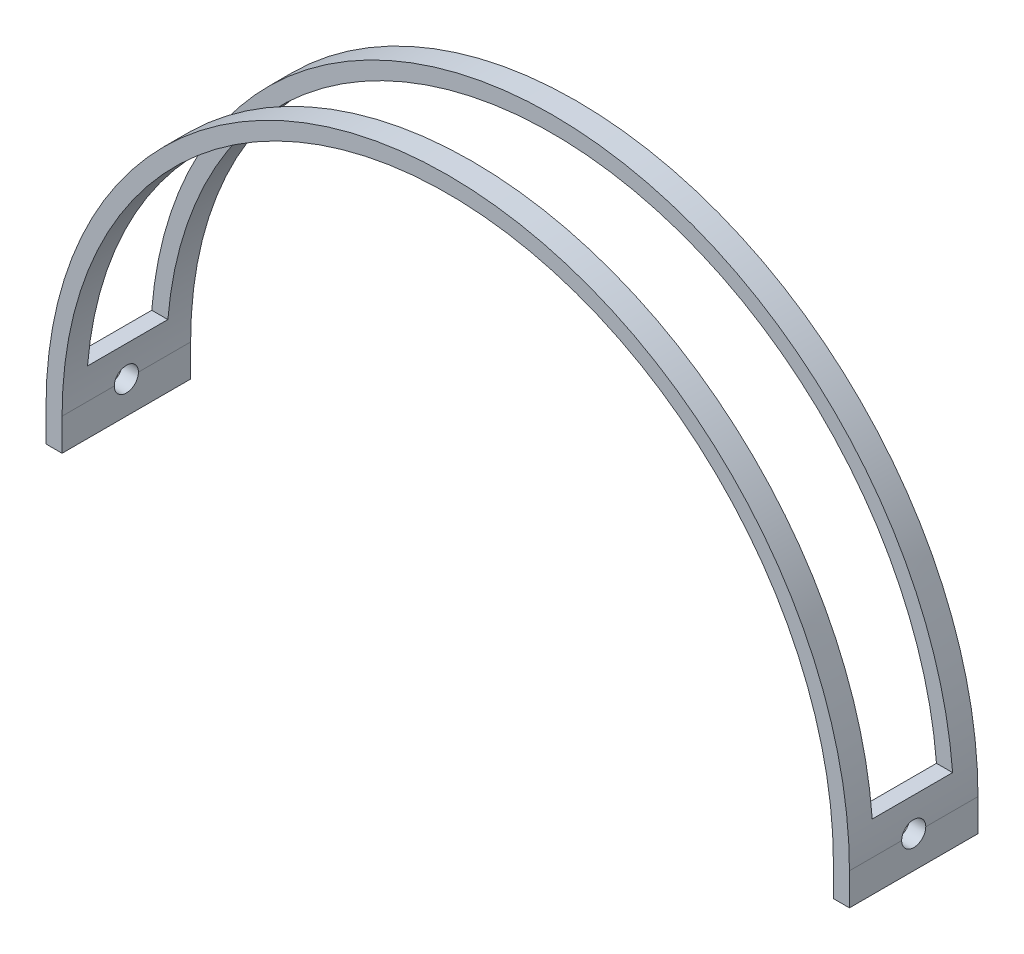
ISO-10303-21;
HEADER;
FILE_DESCRIPTION(('STEP AP214'),'2;1');
FILE_NAME('part.step','',(''),(''),'','','');
FILE_SCHEMA(('AUTOMOTIVE_DESIGN { 1 0 10303 214 1 1 1 1 }'));
ENDSEC;
DATA;
#1=APPLICATION_CONTEXT('core data for automotive mechanical design processes');
#2=APPLICATION_PROTOCOL_DEFINITION('international standard','automotive_design',2000,#1);
#3=PRODUCT_CONTEXT('',#1,'mechanical');
#4=PRODUCT('Part','Part','',(#3));
#5=PRODUCT_RELATED_PRODUCT_CATEGORY('part','',(#4));
#6=PRODUCT_DEFINITION_FORMATION('','',#4);
#7=PRODUCT_DEFINITION_CONTEXT('part definition',#1,'design');
#8=PRODUCT_DEFINITION('design','',#6,#7);
#9=PRODUCT_DEFINITION_SHAPE('','',#8);
#10=(LENGTH_UNIT() NAMED_UNIT(*) SI_UNIT(.MILLI.,.METRE.));
#11=(NAMED_UNIT(*) PLANE_ANGLE_UNIT() SI_UNIT($,.RADIAN.));
#12=(NAMED_UNIT(*) SI_UNIT($,.STERADIAN.) SOLID_ANGLE_UNIT());
#13=UNCERTAINTY_MEASURE_WITH_UNIT(LENGTH_MEASURE(1.E-05),#10,'distance_accuracy_value','');
#14=(GEOMETRIC_REPRESENTATION_CONTEXT(3) GLOBAL_UNCERTAINTY_ASSIGNED_CONTEXT((#13)) GLOBAL_UNIT_ASSIGNED_CONTEXT((#10,
#11,#12)) REPRESENTATION_CONTEXT('',''));
#15=CARTESIAN_POINT('',(0.,0.,0.));
#16=DIRECTION('',(0.,0.,1.));
#17=DIRECTION('',(1.,0.,0.));
#18=AXIS2_PLACEMENT_3D('',#15,#16,#17);
#19=CARTESIAN_POINT('',(0.,0.,80.));
#20=DIRECTION('',(0.,0.,-1.));
#21=DIRECTION('',(-1.,0.,0.));
#22=AXIS2_PLACEMENT_3D('',#19,#20,#21);
#23=CYLINDRICAL_SURFACE('',#22,240.);
#24=DIRECTION('',(0.,0.,-1.));
#25=VECTOR('',#24,1.);
#26=CARTESIAN_POINT('',(239.165214862028,20.,80.));
#27=LINE('',#26,#25);
#28=CARTESIAN_POINT('',(239.165214862028,20.,65.));
#29=VERTEX_POINT('',#28);
#30=CARTESIAN_POINT('',(239.165214862028,20.,15.));
#31=VERTEX_POINT('',#30);
#32=EDGE_CURVE('E147',#29,#31,#27,.T.);
#33=ORIENTED_EDGE('',*,*,#32,.T.);
#34=CARTESIAN_POINT('',(0.,0.,15.));
#35=DIRECTION('',(0.,0.,-1.));
#36=DIRECTION('',(0.,1.,0.));
#37=AXIS2_PLACEMENT_3D('',#34,#35,#36);
#38=CIRCLE('',#37,240.);
#39=CARTESIAN_POINT('',(-239.165214862028,20.,15.));
#40=VERTEX_POINT('',#39);
#41=EDGE_CURVE('E161',#31,#40,#38,.F.);
#42=ORIENTED_EDGE('',*,*,#41,.T.);
#43=DIRECTION('',(0.,0.,-1.));
#44=VECTOR('',#43,1.);
#45=CARTESIAN_POINT('',(-239.165214862028,20.,80.));
#46=LINE('',#45,#44);
#47=CARTESIAN_POINT('',(-239.165214862028,20.,65.));
#48=VERTEX_POINT('',#47);
#49=EDGE_CURVE('E153',#40,#48,#46,.F.);
#50=ORIENTED_EDGE('',*,*,#49,.T.);
#51=CARTESIAN_POINT('',(0.,0.,65.));
#52=DIRECTION('',(0.,0.,1.));
#53=DIRECTION('',(0.,-1.,0.));
#54=AXIS2_PLACEMENT_3D('',#51,#52,#53);
#55=CIRCLE('',#54,240.);
#56=EDGE_CURVE('E142',#48,#29,#55,.F.);
#57=ORIENTED_EDGE('',*,*,#56,.T.);
#58=EDGE_LOOP('',(#33,#42,#50,#57));
#59=FACE_BOUND('',#58,.T.);
#60=DIRECTION('',(0.,0.,-1.));
#61=VECTOR('',#60,1.);
#62=CARTESIAN_POINT('',(240.,0.,80.));
#63=LINE('',#62,#61);
#64=CARTESIAN_POINT('',(240.,0.,32.5));
#65=VERTEX_POINT('',#64);
#66=CARTESIAN_POINT('',(240.,0.,0.));
#67=VERTEX_POINT('',#66);
#68=EDGE_CURVE('E239',#65,#67,#63,.T.);
#69=ORIENTED_EDGE('',*,*,#68,.F.);
#70=CARTESIAN_POINT('',(240.,0.,32.5));
#71=CARTESIAN_POINT('',(240.000002801135,0.210885208766696,32.4999772629314));
#72=CARTESIAN_POINT('',(239.99972214184,0.421767080877066,32.5088935588531));
#73=CARTESIAN_POINT('',(239.998614146376,0.842021105951972,32.5444399422899));
#74=CARTESIAN_POINT('',(239.997786837365,1.05139333339748,32.5710691497785));
#75=CARTESIAN_POINT('',(239.995606570875,1.46699603359064,32.6418515245403));
#76=CARTESIAN_POINT('',(239.994253993733,1.67322866762785,32.6859920127359));
#77=CARTESIAN_POINT('',(239.991062411202,2.08124009056733,32.7914750007671));
#78=CARTESIAN_POINT('',(239.98922341154,2.2830189318603,32.8528172981386));
#79=CARTESIAN_POINT('',(239.985110301719,2.68074743274702,32.9922887255023));
#80=CARTESIAN_POINT('',(239.982836071098,2.87669546109411,33.0704225037889));
#81=CARTESIAN_POINT('',(239.977916476103,3.26138358145405,33.2429422021313));
#82=CARTESIAN_POINT('',(239.975270974911,3.45012098347058,33.3373341164899));
#83=CARTESIAN_POINT('',(239.969685592726,3.81890001023004,33.5416394831287));
#84=CARTESIAN_POINT('',(239.966745824646,3.99894493135549,33.6515469885108));
#85=CARTESIAN_POINT('',(239.960654366662,4.34914141315914,33.886131623219));
#86=CARTESIAN_POINT('',(239.957502673391,4.519292816558,34.0108089872491));
#87=CARTESIAN_POINT('',(239.951075768427,4.84854247021864,34.2740869993846));
#88=CARTESIAN_POINT('',(239.947800519183,5.00763731778458,34.4126919019237));
#89=CARTESIAN_POINT('',(239.941220244381,5.31359083532973,34.7028122709199));
#90=CARTESIAN_POINT('',(239.937915218115,5.46044921403927,34.854328044526));
#91=CARTESIAN_POINT('',(239.931369340442,5.74087826415524,35.1691864657692));
#92=CARTESIAN_POINT('',(239.928128486958,5.87444936615028,35.3325287298593));
#93=CARTESIAN_POINT('',(239.921801705776,6.12740440892163,35.6699435004097));
#94=CARTESIAN_POINT('',(239.918715832118,6.2467834205807,35.8440197032276));
#95=CARTESIAN_POINT('',(239.91278843918,6.4704296680287,36.2015795487218));
#96=CARTESIAN_POINT('',(239.90994687222,6.57469985522407,36.3850613445734));
#97=CARTESIAN_POINT('',(239.904587126646,6.76745002628413,36.7602295773302));
#98=CARTESIAN_POINT('',(239.902069067485,6.85592418223073,36.9519190102224));
#99=CARTESIAN_POINT('',(239.897429755301,7.01638383409342,37.3420254079224));
#100=CARTESIAN_POINT('',(239.895308399258,7.08837361197202,37.5404406102433));
#101=CARTESIAN_POINT('',(239.891521941241,7.21538225238837,37.9426391809427));
#102=CARTESIAN_POINT('',(239.889856848729,7.2704007629731,38.1464226605544));
#103=CARTESIAN_POINT('',(239.8870307762,7.36305750684572,38.5578378063425));
#104=CARTESIAN_POINT('',(239.885869634194,7.40070132526553,38.7654682135615));
#105=CARTESIAN_POINT('',(239.884083684815,7.45836635336048,39.1831645053278));
#106=CARTESIAN_POINT('',(239.883458878057,7.4783875427979,39.3932303926717));
#107=CARTESIAN_POINT('',(239.882763352469,7.50066472781876,39.8143094668946));
#108=CARTESIAN_POINT('',(239.882692650704,7.50292017624403,40.0253226827497));
#109=CARTESIAN_POINT('',(239.88310738596,7.48964848928435,40.4467840948299));
#110=CARTESIAN_POINT('',(239.883592811128,7.47412173289343,40.6572323030013));
#111=CARTESIAN_POINT('',(239.885105846259,7.42540136680253,41.0760338055421));
#112=CARTESIAN_POINT('',(239.886133359964,7.39221089361965,41.2843874651467));
#113=CARTESIAN_POINT('',(239.888700873051,7.30841619128841,41.6974849861364));
#114=CARTESIAN_POINT('',(239.890240695522,7.25781797314661,41.9022300679655));
#115=CARTESIAN_POINT('',(239.893789524458,7.13955491515325,42.306766714726));
#116=CARTESIAN_POINT('',(239.895798616106,7.07188697658105,42.5065573730247));
#117=CARTESIAN_POINT('',(239.900228740613,6.91997253929826,42.8997229829981));
#118=CARTESIAN_POINT('',(239.902649763981,6.83572642262954,43.0930980823985));
#119=CARTESIAN_POINT('',(239.907835653109,6.65123334653746,43.4721068791441));
#120=CARTESIAN_POINT('',(239.910600595258,6.55098283094891,43.6577388443814));
#121=CARTESIAN_POINT('',(239.916395375651,6.33520890831295,44.0198950658144));
#122=CARTESIAN_POINT('',(239.91942520987,6.21968573332029,44.196419460335));
#123=CARTESIAN_POINT('',(239.925664299888,5.97416819637151,44.5391358363975));
#124=CARTESIAN_POINT('',(239.928873581763,5.84417172847789,44.7053263088041));
#125=CARTESIAN_POINT('',(239.935378903141,5.57069520526451,45.0261079580925));
#126=CARTESIAN_POINT('',(239.938674910223,5.42722013847309,45.1807033885846));
#127=CARTESIAN_POINT('',(239.945263534922,5.12766604646233,45.4773629295521));
#128=CARTESIAN_POINT('',(239.948556148928,4.97157886588342,45.6194188053537));
#129=CARTESIAN_POINT('',(239.955041260607,4.64804656324646,45.8898299367885));
#130=CARTESIAN_POINT('',(239.958233792488,4.48060538529852,46.018189910582));
#131=CARTESIAN_POINT('',(239.964430957927,4.13541799353774,46.2604151057325));
#132=CARTESIAN_POINT('',(239.967435495697,3.9576666138665,46.3742729679874));
#133=CARTESIAN_POINT('',(239.973169525517,3.59320432076461,46.5866046307169));
#134=CARTESIAN_POINT('',(239.975899025968,3.40649368124544,46.685078901123));
#135=CARTESIAN_POINT('',(239.981007239503,3.02531229273361,46.8660048906742));
#136=CARTESIAN_POINT('',(239.983385725243,2.83083661718769,46.948446236542));
#137=CARTESIAN_POINT('',(239.987722133137,2.43562530726583,47.0966375580955));
#138=CARTESIAN_POINT('',(239.98968006456,2.23488981096718,47.1623879016545));
#139=CARTESIAN_POINT('',(239.993117554505,1.82885107724443,47.2766567361662));
#140=CARTESIAN_POINT('',(239.994597720728,1.62355400028839,47.3251971253681));
#141=CARTESIAN_POINT('',(239.997040525409,1.20967980881004,47.4047990119401));
#142=CARTESIAN_POINT('',(239.998003417688,1.00110435475552,47.4358690821276));
#143=CARTESIAN_POINT('',(239.999128417167,0.660064240454553,47.4720699402263));
#144=CARTESIAN_POINT('',(239.999455162185,0.528144866722649,47.482550361737));
#145=CARTESIAN_POINT('',(239.999890942592,0.26415489604813,47.4965103939474));
#146=CARTESIAN_POINT('',(240.00000033748,0.132084910944602,47.500001565058));
#147=CARTESIAN_POINT('',(240.,0.,47.5));
#148=B_SPLINE_CURVE_WITH_KNOTS('',3,(#70,#71,#72,#73,#74,#75,#76,#77,#78,#79,#80,#81,#82,#83,
#84,#85,#86,#87,#88,#89,#90,#91,#92,#93,#94,#95,#96,#97,#98,#99,#100,#101,#102,#103,#104,#105,
#106,#107,#108,#109,#110,#111,#112,#113,#114,#115,#116,#117,#118,#119,#120,#121,#122,#123,#124,
#125,#126,#127,#128,#129,#130,#131,#132,#133,#134,#135,#136,#137,#138,#139,#140,#141,#142,#143,
#144,#145,#146,#147),.UNSPECIFIED.,.F.,.F.,(4,2,2,2,2,2,2,2,2,2,2,2,2,2,2,2,2,2,2,2,2,2,2,2,2,2,
2,2,2,2,2,2,2,2,2,2,2,2,4),(0.,0.632462309478233,1.26489319882012,1.89686700862195,
2.52883338044546,3.16097492194917,3.7933500321035,4.42548341694371,5.05762684819511,
5.68996397021892,6.32231613972412,6.95464781049126,7.58719846147912,8.21962538092255,
8.85228515314943,9.48478039952413,10.1172887618108,10.7495936610855,11.3818992864943,
12.014224385892,12.6465360087288,13.2787353904766,13.9107166884462,14.5428127946555,
15.1748943360009,15.8071165213642,16.4393291017657,17.071633792822,17.7037053783765,
18.336189001837,18.9684540299892,19.6010386337462,20.233603909799,20.8665771028749,
21.499536343875,22.1316872812892,22.7635277461418,23.1603635501253,23.5565424327665),.UNSPECIFIED.);
#149=CARTESIAN_POINT('',(240.,0.,47.5));
#150=VERTEX_POINT('',#149);
#151=EDGE_CURVE('E454',#65,#150,#148,.T.);
#152=ORIENTED_EDGE('',*,*,#151,.T.);
#153=CARTESIAN_POINT('',(240.,0.,80.));
#154=VERTEX_POINT('',#153);
#155=EDGE_CURVE('E231',#154,#150,#63,.T.);
#156=ORIENTED_EDGE('',*,*,#155,.F.);
#157=CARTESIAN_POINT('',(0.,0.,80.));
#158=DIRECTION('',(0.,0.,-1.));
#159=DIRECTION('',(1.,0.,0.));
#160=AXIS2_PLACEMENT_3D('',#157,#158,#159);
#161=CIRCLE('',#160,240.);
#162=CARTESIAN_POINT('',(-240.,0.,80.));
#163=VERTEX_POINT('',#162);
#164=EDGE_CURVE('E399',#163,#154,#161,.T.);
#165=ORIENTED_EDGE('',*,*,#164,.F.);
#166=DIRECTION('',(0.,0.,-1.));
#167=VECTOR('',#166,1.);
#168=CARTESIAN_POINT('',(-240.,0.,80.));
#169=LINE('',#168,#167);
#170=CARTESIAN_POINT('',(-240.,0.,47.5));
#171=VERTEX_POINT('',#170);
#172=EDGE_CURVE('E394',#163,#171,#169,.T.);
#173=ORIENTED_EDGE('',*,*,#172,.T.);
#174=CARTESIAN_POINT('',(-240.,0.,47.5));
#175=CARTESIAN_POINT('',(-240.000002801135,0.210885208766666,47.5000227370686));
#176=CARTESIAN_POINT('',(-239.99972214184,0.421767080877036,47.4911064411469));
#177=CARTESIAN_POINT('',(-239.998614146376,0.842021105951942,47.4555600577101));
#178=CARTESIAN_POINT('',(-239.997786837365,1.05139333339745,47.4289308502215));
#179=CARTESIAN_POINT('',(-239.995606570875,1.46699603359061,47.3581484754597));
#180=CARTESIAN_POINT('',(-239.994253993733,1.67322866762782,47.3140079872641));
#181=CARTESIAN_POINT('',(-239.991062411202,2.0812400905673,47.2085249992329));
#182=CARTESIAN_POINT('',(-239.98922341154,2.28301893186027,47.1471827018614));
#183=CARTESIAN_POINT('',(-239.985110301719,2.68074743274699,47.0077112744977));
#184=CARTESIAN_POINT('',(-239.982836071098,2.87669546109408,46.9295774962111));
#185=CARTESIAN_POINT('',(-239.977916476103,3.26138358145403,46.7570577978687));
#186=CARTESIAN_POINT('',(-239.975270974911,3.45012098347055,46.6626658835101));
#187=CARTESIAN_POINT('',(-239.969685592726,3.81890001023001,46.4583605168713));
#188=CARTESIAN_POINT('',(-239.966745824646,3.99894493135546,46.3484530114893));
#189=CARTESIAN_POINT('',(-239.960654366662,4.34914141315911,46.113868376781));
#190=CARTESIAN_POINT('',(-239.957502673391,4.51929281655797,45.989191012751));
#191=CARTESIAN_POINT('',(-239.951075768427,4.84854247021862,45.7259130006155));
#192=CARTESIAN_POINT('',(-239.947800519183,5.00763731778456,45.5873080980763));
#193=CARTESIAN_POINT('',(-239.941220244381,5.3135908353297,45.2971877290802));
#194=CARTESIAN_POINT('',(-239.937915218115,5.46044921403925,45.145671955474));
#195=CARTESIAN_POINT('',(-239.931369340442,5.74087826415522,44.8308135342309));
#196=CARTESIAN_POINT('',(-239.928128486958,5.87444936615026,44.6674712701408));
#197=CARTESIAN_POINT('',(-239.921801705776,6.12740440892161,44.3300564995903));
#198=CARTESIAN_POINT('',(-239.918715832118,6.24678342058068,44.1559802967724));
#199=CARTESIAN_POINT('',(-239.91278843918,6.47042966802869,43.7984204512782));
#200=CARTESIAN_POINT('',(-239.90994687222,6.57469985522406,43.6149386554266));
#201=CARTESIAN_POINT('',(-239.904587126646,6.76745002628412,43.2397704226699));
#202=CARTESIAN_POINT('',(-239.902069067485,6.85592418223071,43.0480809897776));
#203=CARTESIAN_POINT('',(-239.897429755301,7.01638383409341,42.6579745920777));
#204=CARTESIAN_POINT('',(-239.895308399258,7.08837361197201,42.4595593897568));
#205=CARTESIAN_POINT('',(-239.891521941241,7.21538225238836,42.0573608190573));
#206=CARTESIAN_POINT('',(-239.889856848729,7.2704007629731,41.8535773394457));
#207=CARTESIAN_POINT('',(-239.8870307762,7.36305750684572,41.4421621936576));
#208=CARTESIAN_POINT('',(-239.885869634194,7.40070132526553,41.2345317864386));
#209=CARTESIAN_POINT('',(-239.884083684815,7.45836635336048,40.8168354946722));
#210=CARTESIAN_POINT('',(-239.883458878057,7.4783875427979,40.6067696073283));
#211=CARTESIAN_POINT('',(-239.882763352469,7.50066472781876,40.1856905331054));
#212=CARTESIAN_POINT('',(-239.882692650704,7.50292017624403,39.9746773172503));
#213=CARTESIAN_POINT('',(-239.88310738596,7.48964848928436,39.5532159051701));
#214=CARTESIAN_POINT('',(-239.883592811128,7.47412173289343,39.3427676969987));
#215=CARTESIAN_POINT('',(-239.885105846259,7.42540136680254,38.9239661944579));
#216=CARTESIAN_POINT('',(-239.886133359964,7.39221089361965,38.7156125348533));
#217=CARTESIAN_POINT('',(-239.888700873051,7.30841619128842,38.3025150138636));
#218=CARTESIAN_POINT('',(-239.890240695522,7.25781797314662,38.0977699320345));
#219=CARTESIAN_POINT('',(-239.893789524458,7.13955491515326,37.6932332852741));
#220=CARTESIAN_POINT('',(-239.895798616106,7.07188697658106,37.4934426269753));
#221=CARTESIAN_POINT('',(-239.900228740613,6.91997253929827,37.1002770170019));
#222=CARTESIAN_POINT('',(-239.902649763981,6.83572642262955,36.9069019176016));
#223=CARTESIAN_POINT('',(-239.907835653109,6.65123334653747,36.5278931208559));
#224=CARTESIAN_POINT('',(-239.910600595258,6.55098283094892,36.3422611556186));
#225=CARTESIAN_POINT('',(-239.916395375651,6.33520890831296,35.9801049341856));
#226=CARTESIAN_POINT('',(-239.91942520987,6.21968573332031,35.803580539665));
#227=CARTESIAN_POINT('',(-239.925664299888,5.97416819637153,35.4608641636025));
#228=CARTESIAN_POINT('',(-239.928873581763,5.84417172847791,35.2946736911959));
#229=CARTESIAN_POINT('',(-239.935378903141,5.57069520526453,34.9738920419075));
#230=CARTESIAN_POINT('',(-239.938674910223,5.42722013847311,34.8192966114154));
#231=CARTESIAN_POINT('',(-239.945263534922,5.12766604646235,34.5226370704479));
#232=CARTESIAN_POINT('',(-239.948556148928,4.97157886588344,34.3805811946464));
#233=CARTESIAN_POINT('',(-239.955041260607,4.64804656324648,34.1101700632115));
#234=CARTESIAN_POINT('',(-239.958233792488,4.48060538529854,33.9818100894181));
#235=CARTESIAN_POINT('',(-239.964430957927,4.13541799353777,33.7395848942675));
#236=CARTESIAN_POINT('',(-239.967435495697,3.95766661386652,33.6257270320127));
#237=CARTESIAN_POINT('',(-239.973169525517,3.59320432076463,33.4133953692831));
#238=CARTESIAN_POINT('',(-239.975899025968,3.40649368124547,33.314921098877));
#239=CARTESIAN_POINT('',(-239.981007239503,3.02531229273364,33.1339951093258));
#240=CARTESIAN_POINT('',(-239.983385725243,2.83083661718772,33.051553763458));
#241=CARTESIAN_POINT('',(-239.987722133137,2.43562530726586,32.9033624419045));
#242=CARTESIAN_POINT('',(-239.98968006456,2.23488981096722,32.8376120983455));
#243=CARTESIAN_POINT('',(-239.993117554505,1.82885107724446,32.7233432638338));
#244=CARTESIAN_POINT('',(-239.994597720728,1.62355400028843,32.6748028746319));
#245=CARTESIAN_POINT('',(-239.997040525409,1.20967980881007,32.5952009880599));
#246=CARTESIAN_POINT('',(-239.998003417688,1.00110435475556,32.5641309178724));
#247=CARTESIAN_POINT('',(-239.999128417167,0.660064240454576,32.5279300597737));
#248=CARTESIAN_POINT('',(-239.999455162185,0.528144866722664,32.517449638263));
#249=CARTESIAN_POINT('',(-239.999890942592,0.264154896048125,32.5034896060526));
#250=CARTESIAN_POINT('',(-240.00000033748,0.132084910944586,32.499998434942));
#251=CARTESIAN_POINT('',(-240.,0.,32.5));
#252=B_SPLINE_CURVE_WITH_KNOTS('',3,(#174,#175,#176,#177,#178,#179,#180,#181,#182,#183,#184,
#185,#186,#187,#188,#189,#190,#191,#192,#193,#194,#195,#196,#197,#198,#199,#200,#201,#202,#203,
#204,#205,#206,#207,#208,#209,#210,#211,#212,#213,#214,#215,#216,#217,#218,#219,#220,#221,#222,
#223,#224,#225,#226,#227,#228,#229,#230,#231,#232,#233,#234,#235,#236,#237,#238,#239,#240,#241,
#242,#243,#244,#245,#246,#247,#248,#249,#250,#251),.UNSPECIFIED.,.F.,.F.,(4,2,2,2,2,2,2,2,2,2,2,
2,2,2,2,2,2,2,2,2,2,2,2,2,2,2,2,2,2,2,2,2,2,2,2,2,2,2,4),(0.,0.632462309478232,1.26489319882012,
1.89686700862196,2.52883338044545,3.16097492194918,3.7933500321035,4.4254834169437,
5.0576268481951,5.68996397021891,6.32231613972411,6.95464781049125,7.58719846147911,
8.21962538092255,8.85228515314942,9.48478039952412,10.1172887618108,10.7495936610855,
11.3818992864943,12.014224385892,12.6465360087288,13.2787353904766,13.9107166884462,
14.5428127946555,15.1748943360009,15.8071165213642,16.4393291017657,17.071633792822,
17.7037053783765,18.336189001837,18.9684540299892,19.6010386337462,20.233603909799,
20.8665771028749,21.499536343875,22.1316872812892,22.7635277461418,23.1603635501253,
23.5565424327666),.UNSPECIFIED.);
#253=CARTESIAN_POINT('',(-240.,0.,32.5));
#254=VERTEX_POINT('',#253);
#255=EDGE_CURVE('E170',#171,#254,#252,.T.);
#256=ORIENTED_EDGE('',*,*,#255,.T.);
#257=CARTESIAN_POINT('',(-240.,0.,0.));
#258=VERTEX_POINT('',#257);
#259=EDGE_CURVE('E405',#254,#258,#169,.T.);
#260=ORIENTED_EDGE('',*,*,#259,.T.);
#261=CARTESIAN_POINT('',(0.,0.,0.));
#262=DIRECTION('',(0.,0.,-1.));
#263=DIRECTION('',(1.,0.,0.));
#264=AXIS2_PLACEMENT_3D('',#261,#262,#263);
#265=CIRCLE('',#264,240.);
#266=EDGE_CURVE('E398',#258,#67,#265,.T.);
#267=ORIENTED_EDGE('',*,*,#266,.T.);
#268=EDGE_LOOP('',(#69,#152,#156,#165,#173,#256,#260,#267));
#269=FACE_BOUND('',#268,.T.);
#270=ADVANCED_FACE('F33',(#59,#269),#23,.F.);
#271=CARTESIAN_POINT('',(240.,0.,80.));
#272=DIRECTION('',(1.,0.,0.));
#273=DIRECTION('',(0.,0.,-1.));
#274=AXIS2_PLACEMENT_3D('',#271,#272,#273);
#275=PLANE('',#274);
#276=ORIENTED_EDGE('',*,*,#155,.T.);
#277=CARTESIAN_POINT('',(240.,0.,40.));
#278=DIRECTION('',(1.,0.,0.));
#279=DIRECTION('',(0.,0.,-1.));
#280=AXIS2_PLACEMENT_3D('',#277,#278,#279);
#281=CIRCLE('',#280,7.5);
#282=EDGE_CURVE('E205',#150,#65,#281,.T.);
#283=ORIENTED_EDGE('',*,*,#282,.T.);
#284=ORIENTED_EDGE('',*,*,#68,.T.);
#285=DIRECTION('',(0.,-1.,0.));
#286=VECTOR('',#285,1.);
#287=CARTESIAN_POINT('',(240.,0.,0.));
#288=LINE('',#287,#286);
#289=CARTESIAN_POINT('',(240.,-20.,0.));
#290=VERTEX_POINT('',#289);
#291=EDGE_CURVE('E426',#67,#290,#288,.T.);
#292=ORIENTED_EDGE('',*,*,#291,.T.);
#293=DIRECTION('',(0.,0.,-1.));
#294=VECTOR('',#293,1.);
#295=CARTESIAN_POINT('',(240.,-20.,80.));
#296=LINE('',#295,#294);
#297=CARTESIAN_POINT('',(240.,-20.,80.));
#298=VERTEX_POINT('',#297);
#299=EDGE_CURVE('E244',#298,#290,#296,.T.);
#300=ORIENTED_EDGE('',*,*,#299,.F.);
#301=DIRECTION('',(0.,-1.,0.));
#302=VECTOR('',#301,1.);
#303=CARTESIAN_POINT('',(240.,0.,80.));
#304=LINE('',#303,#302);
#305=EDGE_CURVE('E234',#154,#298,#304,.T.);
#306=ORIENTED_EDGE('',*,*,#305,.F.);
#307=EDGE_LOOP('',(#276,#283,#284,#292,#300,#306));
#308=FACE_BOUND('',#307,.T.);
#309=ADVANCED_FACE('F221',(#308),#275,.F.);
#310=CARTESIAN_POINT('',(240.,-20.,80.));
#311=DIRECTION('',(0.,1.,0.));
#312=DIRECTION('',(0.,0.,1.));
#313=AXIS2_PLACEMENT_3D('',#310,#311,#312);
#314=PLANE('',#313);
#315=DIRECTION('',(1.,0.,0.));
#316=VECTOR('',#315,1.);
#317=CARTESIAN_POINT('',(240.,-20.,0.));
#318=LINE('',#317,#316);
#319=CARTESIAN_POINT('',(250.,-20.,0.));
#320=VERTEX_POINT('',#319);
#321=EDGE_CURVE('E424',#290,#320,#318,.T.);
#322=ORIENTED_EDGE('',*,*,#321,.T.);
#323=DIRECTION('',(0.,0.,-1.));
#324=VECTOR('',#323,1.);
#325=CARTESIAN_POINT('',(250.,-20.,80.));
#326=LINE('',#325,#324);
#327=CARTESIAN_POINT('',(250.,-20.,80.));
#328=VERTEX_POINT('',#327);
#329=EDGE_CURVE('E415',#328,#320,#326,.T.);
#330=ORIENTED_EDGE('',*,*,#329,.F.);
#331=DIRECTION('',(1.,0.,0.));
#332=VECTOR('',#331,1.);
#333=CARTESIAN_POINT('',(240.,-20.,80.));
#334=LINE('',#333,#332);
#335=EDGE_CURVE('E425',#298,#328,#334,.T.);
#336=ORIENTED_EDGE('',*,*,#335,.F.);
#337=ORIENTED_EDGE('',*,*,#299,.T.);
#338=EDGE_LOOP('',(#322,#330,#336,#337));
#339=FACE_BOUND('',#338,.T.);
#340=ADVANCED_FACE('F218',(#339),#314,.F.);
#341=CARTESIAN_POINT('',(250.,0.,80.));
#342=DIRECTION('',(-1.,0.,0.));
#343=DIRECTION('',(0.,0.,1.));
#344=AXIS2_PLACEMENT_3D('',#341,#342,#343);
#345=PLANE('',#344);
#346=DIRECTION('',(0.,0.,-1.));
#347=VECTOR('',#346,1.);
#348=CARTESIAN_POINT('',(250.,0.,80.));
#349=LINE('',#348,#347);
#350=CARTESIAN_POINT('',(250.,0.,32.5));
#351=VERTEX_POINT('',#350);
#352=CARTESIAN_POINT('',(250.,0.,0.));
#353=VERTEX_POINT('',#352);
#354=EDGE_CURVE('E412',#351,#353,#349,.T.);
#355=ORIENTED_EDGE('',*,*,#354,.F.);
#356=CARTESIAN_POINT('',(250.,0.,40.));
#357=DIRECTION('',(1.,0.,0.));
#358=DIRECTION('',(0.,0.,-1.));
#359=AXIS2_PLACEMENT_3D('',#356,#357,#358);
#360=CIRCLE('',#359,7.5);
#361=CARTESIAN_POINT('',(250.,0.,47.5));
#362=VERTEX_POINT('',#361);
#363=EDGE_CURVE('E163',#362,#351,#360,.T.);
#364=ORIENTED_EDGE('',*,*,#363,.F.);
#365=CARTESIAN_POINT('',(250.,0.,80.));
#366=VERTEX_POINT('',#365);
#367=EDGE_CURVE('E413',#366,#362,#349,.T.);
#368=ORIENTED_EDGE('',*,*,#367,.F.);
#369=DIRECTION('',(0.,1.,0.));
#370=VECTOR('',#369,1.);
#371=CARTESIAN_POINT('',(250.,0.,80.));
#372=LINE('',#371,#370);
#373=EDGE_CURVE('E446',#328,#366,#372,.T.);
#374=ORIENTED_EDGE('',*,*,#373,.F.);
#375=ORIENTED_EDGE('',*,*,#329,.T.);
#376=DIRECTION('',(0.,1.,0.));
#377=VECTOR('',#376,1.);
#378=CARTESIAN_POINT('',(250.,0.,0.));
#379=LINE('',#378,#377);
#380=EDGE_CURVE('E428',#320,#353,#379,.T.);
#381=ORIENTED_EDGE('',*,*,#380,.T.);
#382=EDGE_LOOP('',(#355,#364,#368,#374,#375,#381));
#383=FACE_BOUND('',#382,.T.);
#384=ADVANCED_FACE('F212',(#383),#345,.F.);
#385=CARTESIAN_POINT('',(0.,0.,80.));
#386=DIRECTION('',(0.,0.,-1.));
#387=DIRECTION('',(-1.,0.,0.));
#388=AXIS2_PLACEMENT_3D('',#385,#386,#387);
#389=CYLINDRICAL_SURFACE('',#388,250.);
#390=CARTESIAN_POINT('',(0.,0.,15.));
#391=DIRECTION('',(0.,0.,-1.));
#392=DIRECTION('',(0.,1.,0.));
#393=AXIS2_PLACEMENT_3D('',#390,#391,#392);
#394=CIRCLE('',#393,250.);
#395=CARTESIAN_POINT('',(-249.198715887542,20.,15.));
#396=VERTEX_POINT('',#395);
#397=CARTESIAN_POINT('',(249.198715887542,20.,15.));
#398=VERTEX_POINT('',#397);
#399=EDGE_CURVE('E11',#396,#398,#394,.T.);
#400=ORIENTED_EDGE('',*,*,#399,.T.);
#401=DIRECTION('',(0.,0.,-1.));
#402=VECTOR('',#401,1.);
#403=CARTESIAN_POINT('',(249.198715887542,20.,80.));
#404=LINE('',#403,#402);
#405=CARTESIAN_POINT('',(249.198715887542,20.,65.));
#406=VERTEX_POINT('',#405);
#407=EDGE_CURVE('E249',#398,#406,#404,.F.);
#408=ORIENTED_EDGE('',*,*,#407,.T.);
#409=CARTESIAN_POINT('',(0.,0.,65.));
#410=DIRECTION('',(0.,0.,1.));
#411=DIRECTION('',(0.,-1.,0.));
#412=AXIS2_PLACEMENT_3D('',#409,#410,#411);
#413=CIRCLE('',#412,250.);
#414=CARTESIAN_POINT('',(-249.198715887542,20.,65.));
#415=VERTEX_POINT('',#414);
#416=EDGE_CURVE('E242',#406,#415,#413,.T.);
#417=ORIENTED_EDGE('',*,*,#416,.T.);
#418=DIRECTION('',(0.,0.,-1.));
#419=VECTOR('',#418,1.);
#420=CARTESIAN_POINT('',(-249.198715887542,20.,80.));
#421=LINE('',#420,#419);
#422=EDGE_CURVE('E41',#415,#396,#421,.T.);
#423=ORIENTED_EDGE('',*,*,#422,.T.);
#424=EDGE_LOOP('',(#400,#408,#417,#423));
#425=FACE_BOUND('',#424,.T.);
#426=ORIENTED_EDGE('',*,*,#367,.T.);
#427=CARTESIAN_POINT('',(250.,0.,47.5));
#428=CARTESIAN_POINT('',(250.000002689274,0.210889490570849,47.5000227326143));
#429=CARTESIAN_POINT('',(249.999733245333,0.421775650448988,47.4911060796824));
#430=CARTESIAN_POINT('',(249.998669526453,0.842038299258242,47.4555582408181));
#431=CARTESIAN_POINT('',(249.997875277514,1.05141486245807,47.428927932452));
#432=CARTESIAN_POINT('',(249.99578213551,1.46702658213651,47.3581425237906));
#433=CARTESIAN_POINT('',(249.99448360679,1.67326389519153,47.314000075588));
#434=CARTESIAN_POINT('',(249.991419559766,2.08128464289664,47.2085122854086));
#435=CARTESIAN_POINT('',(249.989654046972,2.28306813007089,47.1471671464208));
#436=CARTESIAN_POINT('',(249.985705299952,2.68080595413018,47.0076890549184));
#437=CARTESIAN_POINT('',(249.983521949779,2.87675865553017,46.9295514418621));
#438=CARTESIAN_POINT('',(249.978798952988,3.26145586722469,46.7570230922702));
#439=CARTESIAN_POINT('',(249.976259175022,3.45019768744308,46.6626263611025));
#440=CARTESIAN_POINT('',(249.97089701622,3.81898501820359,46.4583104498996));
#441=CARTESIAN_POINT('',(249.968074743932,3.99903382992356,46.3483972254859));
#442=CARTESIAN_POINT('',(249.962226764511,4.34923746900704,46.1138002661069));
#443=CARTESIAN_POINT('',(249.959201054151,4.51939213937188,45.9891162968572));
#444=CARTESIAN_POINT('',(249.953031149371,4.84864358310752,45.7258274377879));
#445=CARTESIAN_POINT('',(249.949886921708,5.00773721792361,45.5872186238688));
#446=CARTESIAN_POINT('',(249.943569910258,5.31368790595361,45.2970904222867));
#447=CARTESIAN_POINT('',(249.940397125794,5.46054466807797,45.1455707276742));
#448=CARTESIAN_POINT('',(249.934113195692,5.74097000051709,44.8307045857529));
#449=CARTESIAN_POINT('',(249.931002048059,5.87453900142136,44.6673585219738));
#450=CARTESIAN_POINT('',(249.9249285122,6.12748931658026,44.3299364192391));
#451=CARTESIAN_POINT('',(249.921966175863,6.24686570151206,44.1558566840013));
#452=CARTESIAN_POINT('',(249.916276157091,6.47050436864386,43.798293082044));
#453=CARTESIAN_POINT('',(249.913548425098,6.57476984612414,43.6148112145942));
#454=CARTESIAN_POINT('',(249.908403424834,6.76751065361965,43.2396436194625));
#455=CARTESIAN_POINT('',(249.905986271239,6.855980155885,43.0479548961557));
#456=CARTESIAN_POINT('',(249.901532897576,7.01643068761574,42.6578506904474));
#457=CARTESIAN_POINT('',(249.899496578649,7.08841599717788,42.4594369695771));
#458=CARTESIAN_POINT('',(249.895861933128,7.21541601017067,42.0572421097431));
#459=CARTESIAN_POINT('',(249.894263615633,7.27043036104409,41.853460859369));
#460=CARTESIAN_POINT('',(249.891550871022,7.36308042447579,41.4420454892748));
#461=CARTESIAN_POINT('',(249.890436300935,7.40072127194179,41.2344125268623));
#462=CARTESIAN_POINT('',(249.888722037997,7.45837998051632,40.8167115476875));
#463=CARTESIAN_POINT('',(249.888122345745,7.47839782112542,40.6066435280931));
#464=CARTESIAN_POINT('',(249.887454876191,7.5006679960939,40.1855605134608));
#465=CARTESIAN_POINT('',(249.887387115362,7.5029197802436,39.974545489297));
#466=CARTESIAN_POINT('',(249.887785474261,7.48964047556707,39.5530807435375));
#467=CARTESIAN_POINT('',(249.888251582614,7.47410976560444,39.3426310099938));
#468=CARTESIAN_POINT('',(249.889704302789,7.42538052800358,38.9238208967363));
#469=CARTESIAN_POINT('',(249.890690836534,7.39218465056011,38.715460208392));
#470=CARTESIAN_POINT('',(249.893155902958,7.30837786527828,38.3023490325884));
#471=CARTESIAN_POINT('',(249.894634265799,7.2577729688961,38.0975973245452));
#472=CARTESIAN_POINT('',(249.898041418298,7.13949526999782,37.6930479435755));
#473=CARTESIAN_POINT('',(249.899970289711,7.07181936937852,37.4932511771252));
#474=CARTESIAN_POINT('',(249.904223502672,6.91988772976458,37.100074017432));
#475=CARTESIAN_POINT('',(249.906547835099,6.83563237319875,36.90669347631));
#476=CARTESIAN_POINT('',(249.911526555387,6.65112085301868,36.5276772760823));
#477=CARTESIAN_POINT('',(249.91418101202,6.55086135418276,36.3420432415226));
#478=CARTESIAN_POINT('',(249.919744213109,6.33506872665425,35.9798836960621));
#479=CARTESIAN_POINT('',(249.922652953693,6.2195358304905,35.8033580465482));
#480=CARTESIAN_POINT('',(249.928642660391,5.97399824328018,35.4606401910479));
#481=CARTESIAN_POINT('',(249.931723651499,5.84399144919871,35.2944494921957));
#482=CARTESIAN_POINT('',(249.93796889461,5.57049381598491,34.973668565606));
#483=CARTESIAN_POINT('',(249.941133115496,5.42700796606634,34.8190740833894));
#484=CARTESIAN_POINT('',(249.947458162182,5.12743708890903,34.5224227572377));
#485=CARTESIAN_POINT('',(249.950618984674,4.97134432717624,34.3803737236838));
#486=CARTESIAN_POINT('',(249.956844484285,4.6478015829346,34.1099767610068));
#487=CARTESIAN_POINT('',(249.959909194258,4.480355544483,33.9816241133234));
#488=CARTESIAN_POINT('',(249.965858199859,4.13515926356672,33.7394140167302));
#489=CARTESIAN_POINT('',(249.968742403498,3.95740385464606,33.6255639286173));
#490=CARTESIAN_POINT('',(249.974246737446,3.59293447016599,33.4132481944585));
#491=CARTESIAN_POINT('',(249.97686687582,3.40622076843387,33.3147820785634));
#492=CARTESIAN_POINT('',(249.981770369473,3.02503446197206,33.1338727416933));
#493=CARTESIAN_POINT('',(249.984053506762,2.83055693763804,33.0514398809611));
#494=CARTESIAN_POINT('',(249.988216021901,2.43534301962015,32.9032656173115));
#495=CARTESIAN_POINT('',(249.990095408638,2.23460676382988,32.8375238469441));
#496=CARTESIAN_POINT('',(249.993394933017,1.82856761176481,32.7232720872836));
#497=CARTESIAN_POINT('',(249.994815654133,1.62327087532141,32.6747401972397));
#498=CARTESIAN_POINT('',(249.997160266613,1.20939834224397,32.5951550805935));
#499=CARTESIAN_POINT('',(249.998084401662,1.00082420571191,32.5640932807116));
#500=CARTESIAN_POINT('',(249.99916387021,0.659831742469374,32.527910351192));
#501=CARTESIAN_POINT('',(249.999477324587,0.527958676482766,32.5174373229898));
#502=CARTESIAN_POINT('',(249.999895378765,0.26406164029065,32.5034871429723));
#503=CARTESIAN_POINT('',(250.000000323407,0.132038281165269,32.4999984401267));
#504=CARTESIAN_POINT('',(250.,0.,32.5));
#505=B_SPLINE_CURVE_WITH_KNOTS('',3,(#427,#428,#429,#430,#431,#432,#433,#434,#435,#436,#437,
#438,#439,#440,#441,#442,#443,#444,#445,#446,#447,#448,#449,#450,#451,#452,#453,#454,#455,#456,
#457,#458,#459,#460,#461,#462,#463,#464,#465,#466,#467,#468,#469,#470,#471,#472,#473,#474,#475,
#476,#477,#478,#479,#480,#481,#482,#483,#484,#485,#486,#487,#488,#489,#490,#491,#492,#493,#494,
#495,#496,#497,#498,#499,#500,#501,#502,#503,#504),.UNSPECIFIED.,.F.,.F.,(4,2,2,2,2,2,2,2,2,2,2,
2,2,2,2,2,2,2,2,2,2,2,2,2,2,2,2,2,2,2,2,2,2,2,2,2,2,2,4),(0.,0.6324751677832,1.264919003948,
1.89690674460677,2.52888702822101,3.16104293711121,3.79343241867274,4.42557982982696,
5.05773726906028,5.69007335621275,6.32242448102431,6.95475510783734,7.58730471556709,
8.21972037161073,8.85236887043116,9.48485291625764,10.1173501005179,10.7496602241941,
11.3819710833856,12.0143015249866,12.6466184947691,13.2788406287181,13.9108446707009,
14.5429634935257,15.1750677373358,15.8073038824178,16.4395304031702,17.0718489056393,
17.7039342735215,18.3364104229777,18.9686679689205,19.6012451502721,20.2338030080005,
20.8667682588778,21.4997195739818,22.1318624999676,22.7636949365765,23.1603906085588,
23.5564296614013),.UNSPECIFIED.);
#506=EDGE_CURVE('E199',#362,#351,#505,.T.);
#507=ORIENTED_EDGE('',*,*,#506,.T.);
#508=ORIENTED_EDGE('',*,*,#354,.T.);
#509=CARTESIAN_POINT('',(0.,0.,0.));
#510=DIRECTION('',(0.,0.,1.));
#511=DIRECTION('',(1.,0.,0.));
#512=AXIS2_PLACEMENT_3D('',#509,#510,#511);
#513=CIRCLE('',#512,250.);
#514=CARTESIAN_POINT('',(-250.,0.,0.));
#515=VERTEX_POINT('',#514);
#516=EDGE_CURVE('E430',#353,#515,#513,.T.);
#517=ORIENTED_EDGE('',*,*,#516,.T.);
#518=DIRECTION('',(0.,0.,-1.));
#519=VECTOR('',#518,1.);
#520=CARTESIAN_POINT('',(-250.,0.,80.));
#521=LINE('',#520,#519);
#522=CARTESIAN_POINT('',(-250.,0.,32.5));
#523=VERTEX_POINT('',#522);
#524=EDGE_CURVE('E408',#523,#515,#521,.T.);
#525=ORIENTED_EDGE('',*,*,#524,.F.);
#526=CARTESIAN_POINT('',(-250.,0.,32.5));
#527=CARTESIAN_POINT('',(-250.000002689274,0.210889490570818,32.4999772673857));
#528=CARTESIAN_POINT('',(-249.999733245333,0.421775650448958,32.5088939203177));
#529=CARTESIAN_POINT('',(-249.998669526453,0.842038299258213,32.5444417591819));
#530=CARTESIAN_POINT('',(-249.997875277514,1.05141486245804,32.571072067548));
#531=CARTESIAN_POINT('',(-249.99578213551,1.46702658213648,32.6418574762094));
#532=CARTESIAN_POINT('',(-249.99448360679,1.6732638951915,32.685999924412));
#533=CARTESIAN_POINT('',(-249.991419559766,2.08128464289661,32.7914877145914));
#534=CARTESIAN_POINT('',(-249.989654046972,2.28306813007086,32.8528328535792));
#535=CARTESIAN_POINT('',(-249.985705299952,2.68080595413016,32.9923109450816));
#536=CARTESIAN_POINT('',(-249.983521949779,2.87675865553015,33.0704485581379));
#537=CARTESIAN_POINT('',(-249.978798952988,3.26145586722466,33.2429769077298));
#538=CARTESIAN_POINT('',(-249.976259175022,3.45019768744305,33.3373736388974));
#539=CARTESIAN_POINT('',(-249.97089701622,3.81898501820357,33.5416895501004));
#540=CARTESIAN_POINT('',(-249.968074743932,3.99903382992354,33.6516027745141));
#541=CARTESIAN_POINT('',(-249.962226764511,4.34923746900702,33.8861997338931));
#542=CARTESIAN_POINT('',(-249.959201054151,4.51939213937186,34.0108837031428));
#543=CARTESIAN_POINT('',(-249.953031149371,4.8486435831075,34.2741725622121));
#544=CARTESIAN_POINT('',(-249.949886921708,5.00773721792358,34.4127813761312));
#545=CARTESIAN_POINT('',(-249.943569910258,5.31368790595359,34.7029095777133));
#546=CARTESIAN_POINT('',(-249.940397125794,5.46054466807795,34.8544292723258));
#547=CARTESIAN_POINT('',(-249.934113195692,5.74097000051707,35.1692954142471));
#548=CARTESIAN_POINT('',(-249.931002048059,5.87453900142134,35.3326414780262));
#549=CARTESIAN_POINT('',(-249.9249285122,6.12748931658024,35.6700635807608));
#550=CARTESIAN_POINT('',(-249.921966175863,6.24686570151204,35.8441433159987));
#551=CARTESIAN_POINT('',(-249.916276157091,6.47050436864385,36.201706917956));
#552=CARTESIAN_POINT('',(-249.913548425098,6.57476984612413,36.3851887854058));
#553=CARTESIAN_POINT('',(-249.908403424834,6.76751065361964,36.7603563805375));
#554=CARTESIAN_POINT('',(-249.905986271239,6.85598015588499,36.9520451038442));
#555=CARTESIAN_POINT('',(-249.901532897576,7.01643068761573,37.3421493095526));
#556=CARTESIAN_POINT('',(-249.899496578649,7.08841599717787,37.5405630304229));
#557=CARTESIAN_POINT('',(-249.895861933128,7.21541601017066,37.9427578902569));
#558=CARTESIAN_POINT('',(-249.894263615633,7.27043036104408,38.146539140631));
#559=CARTESIAN_POINT('',(-249.891550871022,7.36308042447578,38.5579545107252));
#560=CARTESIAN_POINT('',(-249.890436300935,7.40072127194178,38.7655874731377));
#561=CARTESIAN_POINT('',(-249.888722037997,7.45837998051632,39.1832884523124));
#562=CARTESIAN_POINT('',(-249.888122345745,7.47839782112542,39.3933564719069));
#563=CARTESIAN_POINT('',(-249.887454876191,7.5006679960939,39.8144394865392));
#564=CARTESIAN_POINT('',(-249.887387115362,7.5029197802436,40.025454510703));
#565=CARTESIAN_POINT('',(-249.887785474261,7.48964047556707,40.4469192564625));
#566=CARTESIAN_POINT('',(-249.888251582614,7.47410976560444,40.6573689900062));
#567=CARTESIAN_POINT('',(-249.889704302789,7.42538052800358,41.0761791032637));
#568=CARTESIAN_POINT('',(-249.890690836534,7.39218465056011,41.284539791608));
#569=CARTESIAN_POINT('',(-249.893155902958,7.30837786527829,41.6976509674115));
#570=CARTESIAN_POINT('',(-249.894634265799,7.25777296889611,41.9024026754548));
#571=CARTESIAN_POINT('',(-249.898041418298,7.13949526999782,42.3069520564245));
#572=CARTESIAN_POINT('',(-249.899970289711,7.07181936937853,42.5067488228748));
#573=CARTESIAN_POINT('',(-249.904223502672,6.91988772976458,42.899925982568));
#574=CARTESIAN_POINT('',(-249.906547835099,6.83563237319876,43.09330652369));
#575=CARTESIAN_POINT('',(-249.911526555387,6.65112085301869,43.4723227239177));
#576=CARTESIAN_POINT('',(-249.91418101202,6.55086135418277,43.6579567584774));
#577=CARTESIAN_POINT('',(-249.919744213109,6.33506872665427,44.0201163039379));
#578=CARTESIAN_POINT('',(-249.922652953693,6.21953583049052,44.1966419534518));
#579=CARTESIAN_POINT('',(-249.928642660391,5.9739982432802,44.539359808952));
#580=CARTESIAN_POINT('',(-249.931723651499,5.84399144919873,44.7055505078043));
#581=CARTESIAN_POINT('',(-249.93796889461,5.57049381598493,45.026331434394));
#582=CARTESIAN_POINT('',(-249.941133115496,5.42700796606636,45.1809259166105));
#583=CARTESIAN_POINT('',(-249.947458162182,5.12743708890905,45.4775772427622));
#584=CARTESIAN_POINT('',(-249.950618984675,4.97134432717626,45.6196262763162));
#585=CARTESIAN_POINT('',(-249.956844484285,4.64780158293463,45.8900232389932));
#586=CARTESIAN_POINT('',(-249.959909194257,4.48035554448302,46.0183758866766));
#587=CARTESIAN_POINT('',(-249.965858199859,4.13515926356674,46.2605859832698));
#588=CARTESIAN_POINT('',(-249.968742403498,3.95740385464609,46.3744360713827));
#589=CARTESIAN_POINT('',(-249.974246737446,3.59293447016602,46.5867518055414));
#590=CARTESIAN_POINT('',(-249.97686687582,3.40622076843389,46.6852179214366));
#591=CARTESIAN_POINT('',(-249.981770369473,3.02503446197209,46.8661272583067));
#592=CARTESIAN_POINT('',(-249.984053506762,2.83055693763806,46.9485601190389));
#593=CARTESIAN_POINT('',(-249.988216021901,2.43534301962018,47.0967343826885));
#594=CARTESIAN_POINT('',(-249.990095408638,2.2346067638299,47.1624761530559));
#595=CARTESIAN_POINT('',(-249.993394933017,1.82856761176484,47.2767279127164));
#596=CARTESIAN_POINT('',(-249.994815654133,1.62327087532143,47.3252598027603));
#597=CARTESIAN_POINT('',(-249.997160266613,1.209398342244,47.4048449194065));
#598=CARTESIAN_POINT('',(-249.998084401662,1.00082420571194,47.4359067192884));
#599=CARTESIAN_POINT('',(-249.99916387021,0.659831742469392,47.472089648808));
#600=CARTESIAN_POINT('',(-249.999477324587,0.527958676482773,47.4825626770102));
#601=CARTESIAN_POINT('',(-249.999895378765,0.264061640290637,47.4965128570277));
#602=CARTESIAN_POINT('',(-250.000000323407,0.132038281165247,47.5000015598733));
#603=CARTESIAN_POINT('',(-250.,0.,47.5));
#604=B_SPLINE_CURVE_WITH_KNOTS('',3,(#526,#527,#528,#529,#530,#531,#532,#533,#534,#535,#536,
#537,#538,#539,#540,#541,#542,#543,#544,#545,#546,#547,#548,#549,#550,#551,#552,#553,#554,#555,
#556,#557,#558,#559,#560,#561,#562,#563,#564,#565,#566,#567,#568,#569,#570,#571,#572,#573,#574,
#575,#576,#577,#578,#579,#580,#581,#582,#583,#584,#585,#586,#587,#588,#589,#590,#591,#592,#593,
#594,#595,#596,#597,#598,#599,#600,#601,#602,#603),.UNSPECIFIED.,.F.,.F.,(4,2,2,2,2,2,2,2,2,2,2,
2,2,2,2,2,2,2,2,2,2,2,2,2,2,2,2,2,2,2,2,2,2,2,2,2,2,2,4),(0.,0.632475167783202,1.264919003948,
1.89690674460677,2.52888702822101,3.16104293711121,3.79343241867274,4.42557982982697,
5.05773726906028,5.69007335621275,6.32242448102431,6.95475510783735,7.5873047155671,
8.21972037161073,8.85236887043116,9.48485291625764,10.1173501005179,10.7496602241941,
11.3819710833856,12.0143015249866,12.6466184947691,13.2788406287181,13.9108446707009,
14.5429634935257,15.1750677373358,15.8073038824178,16.4395304031702,17.0718489056393,
17.7039342735215,18.3364104229777,18.9686679689205,19.6012451502721,20.2338030080005,
20.8667682588778,21.4997195739818,22.1318624999676,22.7636949365765,23.1603906085588,
23.5564296614014),.UNSPECIFIED.);
#605=CARTESIAN_POINT('',(-250.,0.,47.5));
#606=VERTEX_POINT('',#605);
#607=EDGE_CURVE('E178',#523,#606,#604,.T.);
#608=ORIENTED_EDGE('',*,*,#607,.T.);
#609=CARTESIAN_POINT('',(-250.,0.,80.));
#610=VERTEX_POINT('',#609);
#611=EDGE_CURVE('E409',#610,#606,#521,.T.);
#612=ORIENTED_EDGE('',*,*,#611,.F.);
#613=CARTESIAN_POINT('',(0.,0.,80.));
#614=DIRECTION('',(0.,0.,1.));
#615=DIRECTION('',(1.,0.,0.));
#616=AXIS2_PLACEMENT_3D('',#613,#614,#615);
#617=CIRCLE('',#616,250.);
#618=EDGE_CURVE('E444',#366,#610,#617,.T.);
#619=ORIENTED_EDGE('',*,*,#618,.F.);
#620=EDGE_LOOP('',(#426,#507,#508,#517,#525,#608,#612,#619));
#621=FACE_BOUND('',#620,.T.);
#622=ADVANCED_FACE('F206',(#425,#621),#389,.T.);
#623=CARTESIAN_POINT('',(-250.,0.,80.));
#624=DIRECTION('',(1.,0.,0.));
#625=DIRECTION('',(0.,0.,-1.));
#626=AXIS2_PLACEMENT_3D('',#623,#624,#625);
#627=PLANE('',#626);
#628=ORIENTED_EDGE('',*,*,#611,.T.);
#629=CARTESIAN_POINT('',(-250.,0.,40.));
#630=DIRECTION('',(1.,0.,0.));
#631=DIRECTION('',(0.,0.,-1.));
#632=AXIS2_PLACEMENT_3D('',#629,#630,#631);
#633=CIRCLE('',#632,7.5);
#634=EDGE_CURVE('E167',#606,#523,#633,.T.);
#635=ORIENTED_EDGE('',*,*,#634,.T.);
#636=ORIENTED_EDGE('',*,*,#524,.T.);
#637=DIRECTION('',(0.,-1.,0.));
#638=VECTOR('',#637,1.);
#639=CARTESIAN_POINT('',(-250.,0.,0.));
#640=LINE('',#639,#638);
#641=CARTESIAN_POINT('',(-250.,-20.,0.));
#642=VERTEX_POINT('',#641);
#643=EDGE_CURVE('E387',#515,#642,#640,.T.);
#644=ORIENTED_EDGE('',*,*,#643,.T.);
#645=DIRECTION('',(0.,0.,-1.));
#646=VECTOR('',#645,1.);
#647=CARTESIAN_POINT('',(-250.,-20.,80.));
#648=LINE('',#647,#646);
#649=CARTESIAN_POINT('',(-250.,-20.,80.));
#650=VERTEX_POINT('',#649);
#651=EDGE_CURVE('E383',#650,#642,#648,.T.);
#652=ORIENTED_EDGE('',*,*,#651,.F.);
#653=DIRECTION('',(0.,-1.,0.));
#654=VECTOR('',#653,1.);
#655=CARTESIAN_POINT('',(-250.,0.,80.));
#656=LINE('',#655,#654);
#657=EDGE_CURVE('E445',#610,#650,#656,.T.);
#658=ORIENTED_EDGE('',*,*,#657,.F.);
#659=EDGE_LOOP('',(#628,#635,#636,#644,#652,#658));
#660=FACE_BOUND('',#659,.T.);
#661=ADVANCED_FACE('F211',(#660),#627,.F.);
#662=CARTESIAN_POINT('',(-250.,-20.,80.));
#663=DIRECTION('',(0.,1.,0.));
#664=DIRECTION('',(0.,0.,1.));
#665=AXIS2_PLACEMENT_3D('',#662,#663,#664);
#666=PLANE('',#665);
#667=DIRECTION('',(1.,0.,0.));
#668=VECTOR('',#667,1.);
#669=CARTESIAN_POINT('',(-250.,-20.,0.));
#670=LINE('',#669,#668);
#671=CARTESIAN_POINT('',(-240.,-20.,0.));
#672=VERTEX_POINT('',#671);
#673=EDGE_CURVE('E377',#642,#672,#670,.T.);
#674=ORIENTED_EDGE('',*,*,#673,.T.);
#675=DIRECTION('',(0.,0.,-1.));
#676=VECTOR('',#675,1.);
#677=CARTESIAN_POINT('',(-240.,-20.,80.));
#678=LINE('',#677,#676);
#679=CARTESIAN_POINT('',(-240.,-20.,80.));
#680=VERTEX_POINT('',#679);
#681=EDGE_CURVE('E380',#680,#672,#678,.T.);
#682=ORIENTED_EDGE('',*,*,#681,.F.);
#683=DIRECTION('',(1.,0.,0.));
#684=VECTOR('',#683,1.);
#685=CARTESIAN_POINT('',(-250.,-20.,80.));
#686=LINE('',#685,#684);
#687=EDGE_CURVE('E448',#650,#680,#686,.T.);
#688=ORIENTED_EDGE('',*,*,#687,.F.);
#689=ORIENTED_EDGE('',*,*,#651,.T.);
#690=EDGE_LOOP('',(#674,#682,#688,#689));
#691=FACE_BOUND('',#690,.T.);
#692=ADVANCED_FACE('F327',(#691),#666,.F.);
#693=CARTESIAN_POINT('',(-240.,0.,80.));
#694=DIRECTION('',(-1.,0.,0.));
#695=DIRECTION('',(0.,0.,1.));
#696=AXIS2_PLACEMENT_3D('',#693,#694,#695);
#697=PLANE('',#696);
#698=ORIENTED_EDGE('',*,*,#259,.F.);
#699=CARTESIAN_POINT('',(-240.,0.,40.));
#700=DIRECTION('',(-1.,0.,0.));
#701=DIRECTION('',(0.,0.,1.));
#702=AXIS2_PLACEMENT_3D('',#699,#700,#701);
#703=CIRCLE('',#702,7.5);
#704=EDGE_CURVE('E238',#254,#171,#703,.T.);
#705=ORIENTED_EDGE('',*,*,#704,.T.);
#706=ORIENTED_EDGE('',*,*,#172,.F.);
#707=DIRECTION('',(0.,1.,0.));
#708=VECTOR('',#707,1.);
#709=CARTESIAN_POINT('',(-240.,0.,80.));
#710=LINE('',#709,#708);
#711=EDGE_CURVE('E393',#680,#163,#710,.T.);
#712=ORIENTED_EDGE('',*,*,#711,.F.);
#713=ORIENTED_EDGE('',*,*,#681,.T.);
#714=DIRECTION('',(0.,1.,0.));
#715=VECTOR('',#714,1.);
#716=CARTESIAN_POINT('',(-240.,0.,0.));
#717=LINE('',#716,#715);
#718=EDGE_CURVE('E386',#672,#258,#717,.T.);
#719=ORIENTED_EDGE('',*,*,#718,.T.);
#720=EDGE_LOOP('',(#698,#705,#706,#712,#713,#719));
#721=FACE_BOUND('',#720,.T.);
#722=ADVANCED_FACE('F322',(#721),#697,.F.);
#723=CARTESIAN_POINT('',(0.,0.,80.));
#724=DIRECTION('',(0.,0.,1.));
#725=DIRECTION('',(1.,0.,0.));
#726=AXIS2_PLACEMENT_3D('',#723,#724,#725);
#727=PLANE('',#726);
#728=ORIENTED_EDGE('',*,*,#164,.T.);
#729=ORIENTED_EDGE('',*,*,#305,.T.);
#730=ORIENTED_EDGE('',*,*,#335,.T.);
#731=ORIENTED_EDGE('',*,*,#373,.T.);
#732=ORIENTED_EDGE('',*,*,#618,.T.);
#733=ORIENTED_EDGE('',*,*,#657,.T.);
#734=ORIENTED_EDGE('',*,*,#687,.T.);
#735=ORIENTED_EDGE('',*,*,#711,.T.);
#736=EDGE_LOOP('',(#728,#729,#730,#731,#732,#733,#734,#735));
#737=FACE_BOUND('',#736,.T.);
#738=ADVANCED_FACE('F193',(#737),#727,.T.);
#739=CARTESIAN_POINT('',(0.,0.,0.));
#740=DIRECTION('',(0.,0.,1.));
#741=DIRECTION('',(1.,0.,0.));
#742=AXIS2_PLACEMENT_3D('',#739,#740,#741);
#743=PLANE('',#742);
#744=ORIENTED_EDGE('',*,*,#266,.F.);
#745=ORIENTED_EDGE('',*,*,#718,.F.);
#746=ORIENTED_EDGE('',*,*,#673,.F.);
#747=ORIENTED_EDGE('',*,*,#643,.F.);
#748=ORIENTED_EDGE('',*,*,#516,.F.);
#749=ORIENTED_EDGE('',*,*,#380,.F.);
#750=ORIENTED_EDGE('',*,*,#321,.F.);
#751=ORIENTED_EDGE('',*,*,#291,.F.);
#752=EDGE_LOOP('',(#744,#745,#746,#747,#748,#749,#750,#751));
#753=FACE_BOUND('',#752,.T.);
#754=ADVANCED_FACE('F315',(#753),#743,.F.);
#755=CARTESIAN_POINT('',(-250.,0.,40.));
#756=DIRECTION('',(1.,0.,0.));
#757=DIRECTION('',(0.,0.,-1.));
#758=AXIS2_PLACEMENT_3D('',#755,#756,#757);
#759=CYLINDRICAL_SURFACE('',#758,7.5);
#760=ORIENTED_EDGE('',*,*,#704,.F.);
#761=ORIENTED_EDGE('',*,*,#255,.F.);
#762=EDGE_LOOP('',(#760,#761));
#763=FACE_BOUND('',#762,.T.);
#764=ORIENTED_EDGE('',*,*,#634,.F.);
#765=ORIENTED_EDGE('',*,*,#607,.F.);
#766=EDGE_LOOP('',(#764,#765));
#767=FACE_BOUND('',#766,.T.);
#768=ADVANCED_FACE('F190',(#763,#767),#759,.F.);
#769=ORIENTED_EDGE('',*,*,#363,.T.);
#770=ORIENTED_EDGE('',*,*,#506,.F.);
#771=EDGE_LOOP('',(#769,#770));
#772=FACE_BOUND('',#771,.T.);
#773=ORIENTED_EDGE('',*,*,#282,.F.);
#774=ORIENTED_EDGE('',*,*,#151,.F.);
#775=EDGE_LOOP('',(#773,#774));
#776=FACE_BOUND('',#775,.T.);
#777=ADVANCED_FACE('F184',(#772,#776),#759,.F.);
#778=CARTESIAN_POINT('',(-250.,250.,14.9999999999999));
#779=DIRECTION('',(0.,0.,-1.));
#780=DIRECTION('',(0.,1.,0.));
#781=AXIS2_PLACEMENT_3D('',#778,#779,#780);
#782=PLANE('',#781);
#783=DIRECTION('',(1.,0.,0.));
#784=VECTOR('',#783,1.);
#785=CARTESIAN_POINT('',(-250.,20.,15.));
#786=LINE('',#785,#784);
#787=EDGE_CURVE('E157',#31,#398,#786,.T.);
#788=ORIENTED_EDGE('',*,*,#787,.T.);
#789=ORIENTED_EDGE('',*,*,#399,.F.);
#790=EDGE_CURVE('E148',#396,#40,#786,.T.);
#791=ORIENTED_EDGE('',*,*,#790,.T.);
#792=ORIENTED_EDGE('',*,*,#41,.F.);
#793=EDGE_LOOP('',(#788,#789,#791,#792));
#794=FACE_BOUND('',#793,.T.);
#795=ADVANCED_FACE('F189',(#794),#782,.F.);
#796=CARTESIAN_POINT('',(-250.,20.,65.));
#797=DIRECTION('',(0.,-1.,0.));
#798=DIRECTION('',(0.,0.,-1.));
#799=AXIS2_PLACEMENT_3D('',#796,#797,#798);
#800=PLANE('',#799);
#801=ORIENTED_EDGE('',*,*,#790,.F.);
#802=ORIENTED_EDGE('',*,*,#422,.F.);
#803=DIRECTION('',(1.,0.,0.));
#804=VECTOR('',#803,1.);
#805=CARTESIAN_POINT('',(-250.,20.,65.));
#806=LINE('',#805,#804);
#807=EDGE_CURVE('E53',#415,#48,#806,.T.);
#808=ORIENTED_EDGE('',*,*,#807,.T.);
#809=ORIENTED_EDGE('',*,*,#49,.F.);
#810=EDGE_LOOP('',(#801,#802,#808,#809));
#811=FACE_BOUND('',#810,.T.);
#812=ADVANCED_FACE('F152',(#811),#800,.F.);
#813=EDGE_CURVE('E48',#29,#406,#806,.T.);
#814=ORIENTED_EDGE('',*,*,#813,.T.);
#815=ORIENTED_EDGE('',*,*,#407,.F.);
#816=ORIENTED_EDGE('',*,*,#787,.F.);
#817=ORIENTED_EDGE('',*,*,#32,.F.);
#818=EDGE_LOOP('',(#814,#815,#816,#817));
#819=FACE_BOUND('',#818,.T.);
#820=ADVANCED_FACE('F254',(#819),#800,.F.);
#821=CARTESIAN_POINT('',(-250.,20.,65.));
#822=DIRECTION('',(0.,0.,1.));
#823=DIRECTION('',(0.,-1.,0.));
#824=AXIS2_PLACEMENT_3D('',#821,#822,#823);
#825=PLANE('',#824);
#826=ORIENTED_EDGE('',*,*,#807,.F.);
#827=ORIENTED_EDGE('',*,*,#416,.F.);
#828=ORIENTED_EDGE('',*,*,#813,.F.);
#829=ORIENTED_EDGE('',*,*,#56,.F.);
#830=EDGE_LOOP('',(#826,#827,#828,#829));
#831=FACE_BOUND('',#830,.T.);
#832=ADVANCED_FACE('F143',(#831),#825,.F.);
#833=CLOSED_SHELL('',(#270,#309,#340,#384,#622,#661,#692,#722,#738,#754,#768,#777,#795,#812,
#820,#832));
#834=MANIFOLD_SOLID_BREP('B2',#833);
#835=ADVANCED_BREP_SHAPE_REPRESENTATION('',(#18,#834),#14);
#836=SHAPE_DEFINITION_REPRESENTATION(#9,#835);
ENDSEC;
END-ISO-10303-21;
